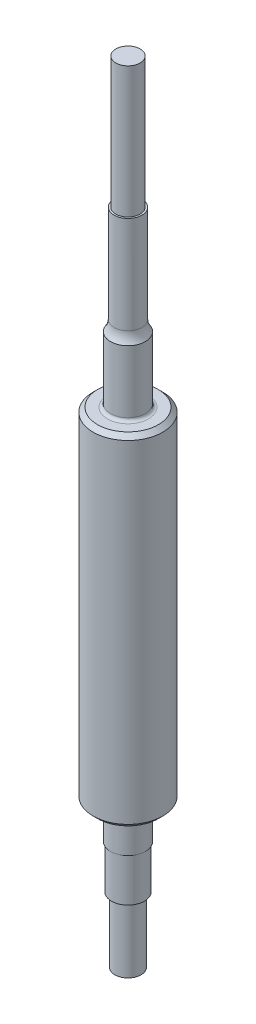
ISO-10303-21;
HEADER;
FILE_DESCRIPTION(('STEP AP214'),'2;1');
FILE_NAME('part.step','',(''),(''),'','','');
FILE_SCHEMA(('AUTOMOTIVE_DESIGN { 1 0 10303 214 1 1 1 1 }'));
ENDSEC;
DATA;
#1=APPLICATION_CONTEXT('core data for automotive mechanical design processes');
#2=APPLICATION_PROTOCOL_DEFINITION('international standard','automotive_design',2000,#1);
#3=PRODUCT_CONTEXT('',#1,'mechanical');
#4=PRODUCT('Part','Part','',(#3));
#5=PRODUCT_RELATED_PRODUCT_CATEGORY('part','',(#4));
#6=PRODUCT_DEFINITION_FORMATION('','',#4);
#7=PRODUCT_DEFINITION_CONTEXT('part definition',#1,'design');
#8=PRODUCT_DEFINITION('design','',#6,#7);
#9=PRODUCT_DEFINITION_SHAPE('','',#8);
#10=(LENGTH_UNIT() NAMED_UNIT(*) SI_UNIT(.MILLI.,.METRE.));
#11=(NAMED_UNIT(*) PLANE_ANGLE_UNIT() SI_UNIT($,.RADIAN.));
#12=(NAMED_UNIT(*) SI_UNIT($,.STERADIAN.) SOLID_ANGLE_UNIT());
#13=UNCERTAINTY_MEASURE_WITH_UNIT(LENGTH_MEASURE(1.E-05),#10,'distance_accuracy_value','');
#14=(GEOMETRIC_REPRESENTATION_CONTEXT(3) GLOBAL_UNCERTAINTY_ASSIGNED_CONTEXT((#13)) GLOBAL_UNIT_ASSIGNED_CONTEXT((#10,
#11,#12)) REPRESENTATION_CONTEXT('',''));
#15=CARTESIAN_POINT('',(0.,0.,0.));
#16=DIRECTION('',(0.,0.,1.));
#17=DIRECTION('',(1.,0.,0.));
#18=AXIS2_PLACEMENT_3D('',#15,#16,#17);
#19=CARTESIAN_POINT('',(0.,78.2,0.));
#20=DIRECTION('',(0.,-1.,0.));
#21=DIRECTION('',(0.,0.,-1.));
#22=AXIS2_PLACEMENT_3D('',#19,#20,#21);
#23=CYLINDRICAL_SURFACE('',#22,7.975);
#24=CARTESIAN_POINT('',(0.,0.999999999999973,0.));
#25=DIRECTION('',(0.,1.,0.));
#26=DIRECTION('',(0.,0.,1.));
#27=AXIS2_PLACEMENT_3D('',#24,#25,#26);
#28=CIRCLE('',#27,7.975);
#29=CARTESIAN_POINT('',(0.,0.999999999999973,7.975));
#30=VERTEX_POINT('',#29);
#31=EDGE_CURVE('E74',#30,#30,#28,.T.);
#32=ORIENTED_EDGE('',*,*,#31,.T.);
#33=EDGE_LOOP('',(#32));
#34=FACE_BOUND('',#33,.T.);
#35=CARTESIAN_POINT('',(0.,77.2,0.));
#36=DIRECTION('',(0.,1.,0.));
#37=DIRECTION('',(0.,0.,1.));
#38=AXIS2_PLACEMENT_3D('',#35,#36,#37);
#39=CIRCLE('',#38,7.975);
#40=CARTESIAN_POINT('',(0.,77.2,7.975));
#41=VERTEX_POINT('',#40);
#42=EDGE_CURVE('E78',#41,#41,#39,.F.);
#43=ORIENTED_EDGE('',*,*,#42,.T.);
#44=EDGE_LOOP('',(#43));
#45=FACE_BOUND('',#44,.T.);
#46=ADVANCED_FACE('F42',(#34,#45),#23,.T.);
#47=CARTESIAN_POINT('',(0.,78.2,0.));
#48=DIRECTION('',(0.,1.,0.));
#49=DIRECTION('',(0.,0.,1.));
#50=AXIS2_PLACEMENT_3D('',#47,#48,#49);
#51=PLANE('',#50);
#52=CARTESIAN_POINT('',(0.,78.2,0.));
#53=DIRECTION('',(0.,1.,0.));
#54=DIRECTION('',(0.,0.,1.));
#55=AXIS2_PLACEMENT_3D('',#52,#53,#54);
#56=CIRCLE('',#55,4.7);
#57=CARTESIAN_POINT('',(0.,78.2,4.7));
#58=VERTEX_POINT('',#57);
#59=EDGE_CURVE('E60',#58,#58,#56,.F.);
#60=ORIENTED_EDGE('',*,*,#59,.T.);
#61=EDGE_LOOP('',(#60));
#62=FACE_BOUND('',#61,.T.);
#63=CARTESIAN_POINT('',(0.,78.2,0.));
#64=DIRECTION('',(0.,1.,0.));
#65=DIRECTION('',(0.,0.,1.));
#66=AXIS2_PLACEMENT_3D('',#63,#64,#65);
#67=CIRCLE('',#66,6.97500000000001);
#68=CARTESIAN_POINT('',(0.,78.2,6.97500000000001));
#69=VERTEX_POINT('',#68);
#70=EDGE_CURVE('E82',#69,#69,#67,.T.);
#71=ORIENTED_EDGE('',*,*,#70,.T.);
#72=EDGE_LOOP('',(#71));
#73=FACE_BOUND('',#72,.T.);
#74=ADVANCED_FACE('F165',(#62,#73),#51,.T.);
#75=CARTESIAN_POINT('',(0.,0.,0.));
#76=DIRECTION('',(0.,1.,0.));
#77=DIRECTION('',(0.,0.,1.));
#78=AXIS2_PLACEMENT_3D('',#75,#76,#77);
#79=PLANE('',#78);
#80=CARTESIAN_POINT('',(0.,0.,0.));
#81=DIRECTION('',(0.,1.,0.));
#82=DIRECTION('',(0.,0.,1.));
#83=AXIS2_PLACEMENT_3D('',#80,#81,#82);
#84=CIRCLE('',#83,4.7);
#85=CARTESIAN_POINT('',(0.,0.,4.7));
#86=VERTEX_POINT('',#85);
#87=EDGE_CURVE('E50',#86,#86,#84,.T.);
#88=ORIENTED_EDGE('',*,*,#87,.T.);
#89=EDGE_LOOP('',(#88));
#90=FACE_BOUND('',#89,.T.);
#91=CARTESIAN_POINT('',(0.,0.,0.));
#92=DIRECTION('',(0.,1.,0.));
#93=DIRECTION('',(0.,0.,1.));
#94=AXIS2_PLACEMENT_3D('',#91,#92,#93);
#95=CIRCLE('',#94,6.97500000000001);
#96=CARTESIAN_POINT('',(0.,0.,6.97500000000001));
#97=VERTEX_POINT('',#96);
#98=EDGE_CURVE('E70',#97,#97,#95,.F.);
#99=ORIENTED_EDGE('',*,*,#98,.T.);
#100=EDGE_LOOP('',(#99));
#101=FACE_BOUND('',#100,.T.);
#102=ADVANCED_FACE('F161',(#90,#101),#79,.F.);
#103=CARTESIAN_POINT('',(0.,93.2,0.));
#104=DIRECTION('',(0.,-1.,0.));
#105=DIRECTION('',(0.,0.,-1.));
#106=AXIS2_PLACEMENT_3D('',#103,#104,#105);
#107=CYLINDRICAL_SURFACE('',#106,4.);
#108=CARTESIAN_POINT('',(0.,78.9,0.));
#109=DIRECTION('',(0.,1.,0.));
#110=DIRECTION('',(0.,0.,1.));
#111=AXIS2_PLACEMENT_3D('',#108,#109,#110);
#112=CIRCLE('',#111,4.);
#113=CARTESIAN_POINT('',(0.,78.9,4.));
#114=VERTEX_POINT('',#113);
#115=EDGE_CURVE('E66',#114,#114,#112,.T.);
#116=ORIENTED_EDGE('',*,*,#115,.T.);
#117=EDGE_LOOP('',(#116));
#118=FACE_BOUND('',#117,.T.);
#119=CARTESIAN_POINT('',(0.,93.2,0.));
#120=DIRECTION('',(0.,1.,0.));
#121=DIRECTION('',(0.,0.,1.));
#122=AXIS2_PLACEMENT_3D('',#119,#120,#121);
#123=CIRCLE('',#122,4.);
#124=CARTESIAN_POINT('',(0.,93.2,4.));
#125=VERTEX_POINT('',#124);
#126=EDGE_CURVE('E87',#125,#125,#123,.T.);
#127=ORIENTED_EDGE('',*,*,#126,.F.);
#128=EDGE_LOOP('',(#127));
#129=FACE_BOUND('',#128,.T.);
#130=ADVANCED_FACE('F153',(#118,#129),#107,.T.);
#131=CARTESIAN_POINT('',(0.,-8.,0.));
#132=DIRECTION('',(0.,1.,0.));
#133=DIRECTION('',(0.,0.,1.));
#134=AXIS2_PLACEMENT_3D('',#131,#132,#133);
#135=CYLINDRICAL_SURFACE('',#134,4.);
#136=CARTESIAN_POINT('',(0.,-0.7,0.));
#137=DIRECTION('',(0.,1.,0.));
#138=DIRECTION('',(0.,0.,1.));
#139=AXIS2_PLACEMENT_3D('',#136,#137,#138);
#140=CIRCLE('',#139,4.);
#141=CARTESIAN_POINT('',(0.,-0.7,4.));
#142=VERTEX_POINT('',#141);
#143=EDGE_CURVE('E55',#142,#142,#140,.F.);
#144=ORIENTED_EDGE('',*,*,#143,.T.);
#145=EDGE_LOOP('',(#144));
#146=FACE_BOUND('',#145,.T.);
#147=CARTESIAN_POINT('',(0.,-8.,0.));
#148=DIRECTION('',(0.,-1.,0.));
#149=DIRECTION('',(0.,0.,-1.));
#150=AXIS2_PLACEMENT_3D('',#147,#148,#149);
#151=CIRCLE('',#150,4.);
#152=CARTESIAN_POINT('',(0.,-8.,-4.));
#153=VERTEX_POINT('',#152);
#154=EDGE_CURVE('E92',#153,#153,#151,.T.);
#155=ORIENTED_EDGE('',*,*,#154,.F.);
#156=EDGE_LOOP('',(#155));
#157=FACE_BOUND('',#156,.T.);
#158=ADVANCED_FACE('F148',(#146,#157),#135,.T.);
#159=CARTESIAN_POINT('',(0.,-8.,0.));
#160=DIRECTION('',(0.,-1.,0.));
#161=DIRECTION('',(0.,0.,-1.));
#162=AXIS2_PLACEMENT_3D('',#159,#160,#161);
#163=PLANE('',#162);
#164=CARTESIAN_POINT('',(0.,-8.,0.));
#165=DIRECTION('',(0.,-1.,0.));
#166=DIRECTION('',(0.,0.,-1.));
#167=AXIS2_PLACEMENT_3D('',#164,#165,#166);
#168=CIRCLE('',#167,3.76);
#169=CARTESIAN_POINT('',(0.,-8.,-3.76));
#170=VERTEX_POINT('',#169);
#171=EDGE_CURVE('E104',#170,#170,#168,.T.);
#172=ORIENTED_EDGE('',*,*,#171,.F.);
#173=EDGE_LOOP('',(#172));
#174=FACE_BOUND('',#173,.T.);
#175=ORIENTED_EDGE('',*,*,#154,.T.);
#176=EDGE_LOOP('',(#175));
#177=FACE_BOUND('',#176,.T.);
#178=ADVANCED_FACE('F144',(#174,#177),#163,.T.);
#179=CARTESIAN_POINT('',(0.,117.9,0.));
#180=DIRECTION('',(0.,-1.,0.));
#181=DIRECTION('',(0.,0.,-1.));
#182=AXIS2_PLACEMENT_3D('',#179,#180,#181);
#183=CYLINDRICAL_SURFACE('',#182,3.195);
#184=CARTESIAN_POINT('',(0.,95.6066522391073,0.));
#185=DIRECTION('',(0.,-1.,0.));
#186=DIRECTION('',(0.,0.,-1.));
#187=AXIS2_PLACEMENT_3D('',#184,#185,#186);
#188=CIRCLE('',#187,3.195);
#189=CARTESIAN_POINT('',(0.,95.6066522391073,-3.195));
#190=VERTEX_POINT('',#189);
#191=EDGE_CURVE('E10',#190,#190,#188,.F.);
#192=ORIENTED_EDGE('',*,*,#191,.T.);
#193=EDGE_LOOP('',(#192));
#194=FACE_BOUND('',#193,.T.);
#195=CARTESIAN_POINT('',(0.,117.9,0.));
#196=DIRECTION('',(0.,1.,0.));
#197=DIRECTION('',(0.,0.,1.));
#198=AXIS2_PLACEMENT_3D('',#195,#196,#197);
#199=CIRCLE('',#198,3.195);
#200=CARTESIAN_POINT('',(0.,117.9,3.195));
#201=VERTEX_POINT('',#200);
#202=EDGE_CURVE('E96',#201,#201,#199,.T.);
#203=ORIENTED_EDGE('',*,*,#202,.F.);
#204=EDGE_LOOP('',(#203));
#205=FACE_BOUND('',#204,.T.);
#206=ADVANCED_FACE('F147',(#194,#205),#183,.T.);
#207=CARTESIAN_POINT('',(0.,117.9,0.));
#208=DIRECTION('',(0.,1.,0.));
#209=DIRECTION('',(0.,0.,1.));
#210=AXIS2_PLACEMENT_3D('',#207,#208,#209);
#211=PLANE('',#210);
#212=CARTESIAN_POINT('',(0.,117.9,0.));
#213=DIRECTION('',(0.,1.,0.));
#214=DIRECTION('',(0.,0.,1.));
#215=AXIS2_PLACEMENT_3D('',#212,#213,#214);
#216=CIRCLE('',#215,2.79);
#217=CARTESIAN_POINT('',(0.,117.9,2.79));
#218=VERTEX_POINT('',#217);
#219=EDGE_CURVE('E91',#218,#218,#216,.T.);
#220=ORIENTED_EDGE('',*,*,#219,.F.);
#221=EDGE_LOOP('',(#220));
#222=FACE_BOUND('',#221,.T.);
#223=ORIENTED_EDGE('',*,*,#202,.T.);
#224=EDGE_LOOP('',(#223));
#225=FACE_BOUND('',#224,.T.);
#226=ADVANCED_FACE('F216',(#222,#225),#211,.T.);
#227=CARTESIAN_POINT('',(0.,147.9,0.));
#228=DIRECTION('',(0.,-1.,0.));
#229=DIRECTION('',(0.,0.,-1.));
#230=AXIS2_PLACEMENT_3D('',#227,#228,#229);
#231=CYLINDRICAL_SURFACE('',#230,2.79);
#232=CARTESIAN_POINT('',(0.,147.9,0.));
#233=DIRECTION('',(0.,1.,0.));
#234=DIRECTION('',(0.,0.,1.));
#235=AXIS2_PLACEMENT_3D('',#232,#233,#234);
#236=CIRCLE('',#235,2.79);
#237=CARTESIAN_POINT('',(0.,147.9,2.79));
#238=VERTEX_POINT('',#237);
#239=EDGE_CURVE('E100',#238,#238,#236,.T.);
#240=ORIENTED_EDGE('',*,*,#239,.F.);
#241=EDGE_LOOP('',(#240));
#242=FACE_BOUND('',#241,.T.);
#243=ORIENTED_EDGE('',*,*,#219,.T.);
#244=EDGE_LOOP('',(#243));
#245=FACE_BOUND('',#244,.T.);
#246=ADVANCED_FACE('F285',(#242,#245),#231,.T.);
#247=CARTESIAN_POINT('',(0.,147.9,0.));
#248=DIRECTION('',(0.,1.,0.));
#249=DIRECTION('',(0.,0.,1.));
#250=AXIS2_PLACEMENT_3D('',#247,#248,#249);
#251=PLANE('',#250);
#252=ORIENTED_EDGE('',*,*,#239,.T.);
#253=EDGE_LOOP('',(#252));
#254=FACE_BOUND('',#253,.T.);
#255=ADVANCED_FACE('F140',(#254),#251,.T.);
#256=CARTESIAN_POINT('',(0.,-18.,0.));
#257=DIRECTION('',(0.,1.,0.));
#258=DIRECTION('',(0.,0.,1.));
#259=AXIS2_PLACEMENT_3D('',#256,#257,#258);
#260=CYLINDRICAL_SURFACE('',#259,3.76);
#261=CARTESIAN_POINT('',(0.,-18.,0.));
#262=DIRECTION('',(0.,-1.,0.));
#263=DIRECTION('',(0.,0.,-1.));
#264=AXIS2_PLACEMENT_3D('',#261,#262,#263);
#265=CIRCLE('',#264,3.76);
#266=CARTESIAN_POINT('',(0.,-18.,-3.76));
#267=VERTEX_POINT('',#266);
#268=EDGE_CURVE('E108',#267,#267,#265,.T.);
#269=ORIENTED_EDGE('',*,*,#268,.F.);
#270=EDGE_LOOP('',(#269));
#271=FACE_BOUND('',#270,.T.);
#272=ORIENTED_EDGE('',*,*,#171,.T.);
#273=EDGE_LOOP('',(#272));
#274=FACE_BOUND('',#273,.T.);
#275=ADVANCED_FACE('F134',(#271,#274),#260,.T.);
#276=CARTESIAN_POINT('',(0.,-18.,0.));
#277=DIRECTION('',(0.,-1.,0.));
#278=DIRECTION('',(0.,0.,-1.));
#279=AXIS2_PLACEMENT_3D('',#276,#277,#278);
#280=PLANE('',#279);
#281=CARTESIAN_POINT('',(0.,-18.,0.));
#282=DIRECTION('',(0.,-1.,0.));
#283=DIRECTION('',(0.,0.,-1.));
#284=AXIS2_PLACEMENT_3D('',#281,#282,#283);
#285=CIRCLE('',#284,3.);
#286=CARTESIAN_POINT('',(0.,-18.,-3.));
#287=VERTEX_POINT('',#286);
#288=EDGE_CURVE('E86',#287,#287,#285,.T.);
#289=ORIENTED_EDGE('',*,*,#288,.F.);
#290=EDGE_LOOP('',(#289));
#291=FACE_BOUND('',#290,.T.);
#292=ORIENTED_EDGE('',*,*,#268,.T.);
#293=EDGE_LOOP('',(#292));
#294=FACE_BOUND('',#293,.T.);
#295=ADVANCED_FACE('F128',(#291,#294),#280,.T.);
#296=CARTESIAN_POINT('',(0.,-33.,0.));
#297=DIRECTION('',(0.,1.,0.));
#298=DIRECTION('',(0.,0.,1.));
#299=AXIS2_PLACEMENT_3D('',#296,#297,#298);
#300=CYLINDRICAL_SURFACE('',#299,3.);
#301=CARTESIAN_POINT('',(0.,-33.,0.));
#302=DIRECTION('',(0.,-1.,0.));
#303=DIRECTION('',(0.,0.,-1.));
#304=AXIS2_PLACEMENT_3D('',#301,#302,#303);
#305=CIRCLE('',#304,3.);
#306=CARTESIAN_POINT('',(0.,-33.,-3.));
#307=VERTEX_POINT('',#306);
#308=EDGE_CURVE('E115',#307,#307,#305,.T.);
#309=ORIENTED_EDGE('',*,*,#308,.F.);
#310=EDGE_LOOP('',(#309));
#311=FACE_BOUND('',#310,.T.);
#312=ORIENTED_EDGE('',*,*,#288,.T.);
#313=EDGE_LOOP('',(#312));
#314=FACE_BOUND('',#313,.T.);
#315=ADVANCED_FACE('F125',(#311,#314),#300,.T.);
#316=CARTESIAN_POINT('',(0.,-33.,0.));
#317=DIRECTION('',(0.,-1.,0.));
#318=DIRECTION('',(0.,0.,-1.));
#319=AXIS2_PLACEMENT_3D('',#316,#317,#318);
#320=PLANE('',#319);
#321=ORIENTED_EDGE('',*,*,#308,.T.);
#322=EDGE_LOOP('',(#321));
#323=FACE_BOUND('',#322,.T.);
#324=ADVANCED_FACE('F123',(#323),#320,.T.);
#325=CARTESIAN_POINT('',(0.,78.2,0.));
#326=DIRECTION('',(0.,-1.,0.));
#327=DIRECTION('',(0.,0.,-1.));
#328=AXIS2_PLACEMENT_3D('',#325,#326,#327);
#329=CONICAL_SURFACE('',#328,6.97500000000001,0.785398163397451);
#330=ORIENTED_EDGE('',*,*,#42,.F.);
#331=EDGE_LOOP('',(#330));
#332=FACE_BOUND('',#331,.T.);
#333=ORIENTED_EDGE('',*,*,#70,.F.);
#334=EDGE_LOOP('',(#333));
#335=FACE_BOUND('',#334,.T.);
#336=ADVANCED_FACE('F178',(#332,#335),#329,.T.);
#337=CARTESIAN_POINT('',(0.,0.999999999999973,0.));
#338=DIRECTION('',(0.,1.,0.));
#339=DIRECTION('',(0.,0.,1.));
#340=AXIS2_PLACEMENT_3D('',#337,#338,#339);
#341=CONICAL_SURFACE('',#340,7.975,0.785398163397458);
#342=ORIENTED_EDGE('',*,*,#98,.F.);
#343=EDGE_LOOP('',(#342));
#344=FACE_BOUND('',#343,.T.);
#345=ORIENTED_EDGE('',*,*,#31,.F.);
#346=EDGE_LOOP('',(#345));
#347=FACE_BOUND('',#346,.T.);
#348=ADVANCED_FACE('F184',(#344,#347),#341,.T.);
#349=CARTESIAN_POINT('',(0.,78.9,0.));
#350=DIRECTION('',(0.,1.,0.));
#351=DIRECTION('',(0.,0.,1.));
#352=AXIS2_PLACEMENT_3D('',#349,#350,#351);
#353=TOROIDAL_SURFACE('',#352,4.7,0.7);
#354=ORIENTED_EDGE('',*,*,#59,.F.);
#355=EDGE_LOOP('',(#354));
#356=FACE_BOUND('',#355,.T.);
#357=ORIENTED_EDGE('',*,*,#115,.F.);
#358=EDGE_LOOP('',(#357));
#359=FACE_BOUND('',#358,.T.);
#360=ADVANCED_FACE('F190',(#356,#359),#353,.F.);
#361=CARTESIAN_POINT('',(0.,-0.7,0.));
#362=DIRECTION('',(0.,1.,0.));
#363=DIRECTION('',(0.,0.,1.));
#364=AXIS2_PLACEMENT_3D('',#361,#362,#363);
#365=TOROIDAL_SURFACE('',#364,4.7,0.7);
#366=ORIENTED_EDGE('',*,*,#87,.F.);
#367=EDGE_LOOP('',(#366));
#368=FACE_BOUND('',#367,.T.);
#369=ORIENTED_EDGE('',*,*,#143,.F.);
#370=EDGE_LOOP('',(#369));
#371=FACE_BOUND('',#370,.T.);
#372=ADVANCED_FACE('F193',(#368,#371),#365,.F.);
#373=CARTESIAN_POINT('',(0.,95.6066522391073,0.));
#374=DIRECTION('',(0.,-1.,0.));
#375=DIRECTION('',(0.,0.,-1.));
#376=AXIS2_PLACEMENT_3D('',#373,#374,#375);
#377=TOROIDAL_SURFACE('',#376,7.195,4.);
#378=ORIENTED_EDGE('',*,*,#126,.T.);
#379=EDGE_LOOP('',(#378));
#380=FACE_BOUND('',#379,.T.);
#381=ORIENTED_EDGE('',*,*,#191,.F.);
#382=EDGE_LOOP('',(#381));
#383=FACE_BOUND('',#382,.T.);
#384=ADVANCED_FACE('F44',(#380,#383),#377,.F.);
#385=CLOSED_SHELL('',(#46,#74,#102,#130,#158,#178,#206,#226,#246,#255,#275,#295,#315,#324,#336,
#348,#360,#372,#384));
#386=MANIFOLD_SOLID_BREP('B2',#385);
#387=ADVANCED_BREP_SHAPE_REPRESENTATION('',(#18,#386),#14);
#388=SHAPE_DEFINITION_REPRESENTATION(#9,#387);
ENDSEC;
END-ISO-10303-21;
